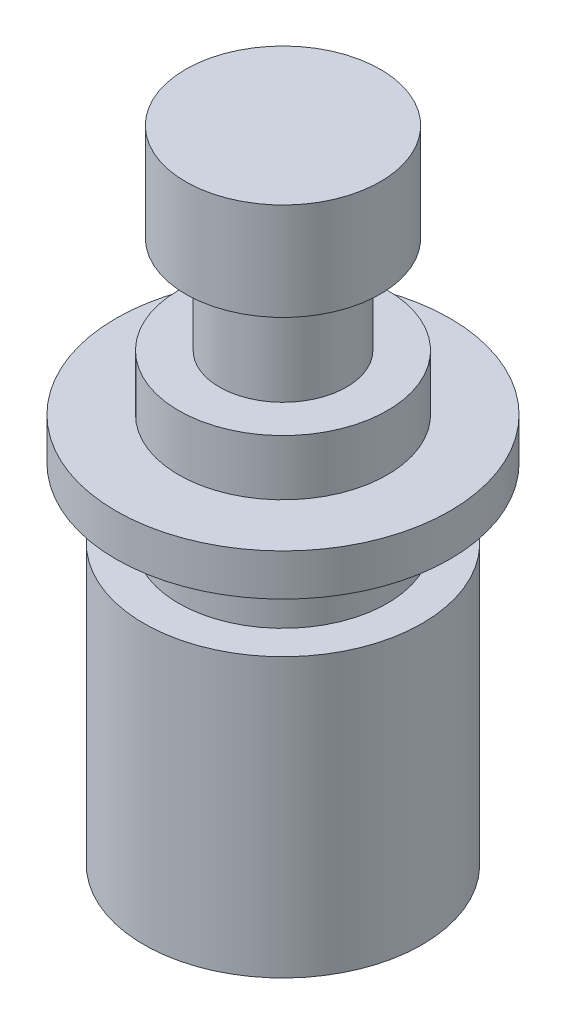
ISO-10303-21;
HEADER;
FILE_DESCRIPTION(('STEP AP214'),'2;1');
FILE_NAME('part.step','',(''),(''),'','','');
FILE_SCHEMA(('AUTOMOTIVE_DESIGN { 1 0 10303 214 1 1 1 1 }'));
ENDSEC;
DATA;
#1=APPLICATION_CONTEXT('core data for automotive mechanical design processes');
#2=APPLICATION_PROTOCOL_DEFINITION('international standard','automotive_design',2000,#1);
#3=PRODUCT_CONTEXT('',#1,'mechanical');
#4=PRODUCT('Part','Part','',(#3));
#5=PRODUCT_RELATED_PRODUCT_CATEGORY('part','',(#4));
#6=PRODUCT_DEFINITION_FORMATION('','',#4);
#7=PRODUCT_DEFINITION_CONTEXT('part definition',#1,'design');
#8=PRODUCT_DEFINITION('design','',#6,#7);
#9=PRODUCT_DEFINITION_SHAPE('','',#8);
#10=(LENGTH_UNIT() NAMED_UNIT(*) SI_UNIT(.MILLI.,.METRE.));
#11=(NAMED_UNIT(*) PLANE_ANGLE_UNIT() SI_UNIT($,.RADIAN.));
#12=(NAMED_UNIT(*) SI_UNIT($,.STERADIAN.) SOLID_ANGLE_UNIT());
#13=UNCERTAINTY_MEASURE_WITH_UNIT(LENGTH_MEASURE(1.E-05),#10,'distance_accuracy_value','');
#14=(GEOMETRIC_REPRESENTATION_CONTEXT(3) GLOBAL_UNCERTAINTY_ASSIGNED_CONTEXT((#13)) GLOBAL_UNIT_ASSIGNED_CONTEXT((#10,
#11,#12)) REPRESENTATION_CONTEXT('',''));
#15=CARTESIAN_POINT('',(0.,0.,0.));
#16=DIRECTION('',(0.,0.,1.));
#17=DIRECTION('',(1.,0.,0.));
#18=AXIS2_PLACEMENT_3D('',#15,#16,#17);
#19=CARTESIAN_POINT('',(0.,-72.5172203765227,0.));
#20=DIRECTION('',(0.,-1.,0.));
#21=DIRECTION('',(1.,0.,0.));
#22=AXIS2_PLACEMENT_3D('',#19,#20,#21);
#23=PLANE('',#22);
#24=CARTESIAN_POINT('',(0.,-72.5172203765227,0.));
#25=DIRECTION('',(0.,1.,0.));
#26=DIRECTION('',(-1.,0.,0.));
#27=AXIS2_PLACEMENT_3D('',#24,#25,#26);
#28=CIRCLE('',#27,3.5);
#29=CARTESIAN_POINT('',(-3.5,-72.5172203765227,0.));
#30=VERTEX_POINT('',#29);
#31=EDGE_CURVE('E10',#30,#30,#28,.T.);
#32=ORIENTED_EDGE('',*,*,#31,.T.);
#33=EDGE_LOOP('',(#32));
#34=FACE_BOUND('',#33,.T.);
#35=ADVANCED_FACE('F33',(#34),#23,.F.);
#36=CARTESIAN_POINT('',(0.,-72.5172203765227,0.));
#37=DIRECTION('',(0.,1.,0.));
#38=DIRECTION('',(-1.,0.,0.));
#39=AXIS2_PLACEMENT_3D('',#36,#37,#38);
#40=CYLINDRICAL_SURFACE('',#39,3.5);
#41=ORIENTED_EDGE('',*,*,#31,.F.);
#42=EDGE_LOOP('',(#41));
#43=FACE_BOUND('',#42,.T.);
#44=CARTESIAN_POINT('',(0.,-76.0172203765227,0.));
#45=DIRECTION('',(0.,1.,0.));
#46=DIRECTION('',(-1.,0.,0.));
#47=AXIS2_PLACEMENT_3D('',#44,#45,#46);
#48=CIRCLE('',#47,3.5);
#49=CARTESIAN_POINT('',(-3.5,-76.0172203765227,0.));
#50=VERTEX_POINT('',#49);
#51=EDGE_CURVE('E39',#50,#50,#48,.T.);
#52=ORIENTED_EDGE('',*,*,#51,.T.);
#53=EDGE_LOOP('',(#52));
#54=FACE_BOUND('',#53,.T.);
#55=ADVANCED_FACE('F89',(#43,#54),#40,.T.);
#56=CARTESIAN_POINT('',(3.5,-76.0172203765227,0.));
#57=DIRECTION('',(0.,1.,0.));
#58=DIRECTION('',(-1.,0.,0.));
#59=AXIS2_PLACEMENT_3D('',#56,#57,#58);
#60=PLANE('',#59);
#61=ORIENTED_EDGE('',*,*,#51,.F.);
#62=EDGE_LOOP('',(#61));
#63=FACE_BOUND('',#62,.T.);
#64=CARTESIAN_POINT('',(0.,-76.0172203765227,0.));
#65=DIRECTION('',(0.,1.,0.));
#66=DIRECTION('',(-1.,0.,0.));
#67=AXIS2_PLACEMENT_3D('',#64,#65,#66);
#68=CIRCLE('',#67,2.28578379991232);
#69=CARTESIAN_POINT('',(-2.28578379991232,-76.0172203765227,0.));
#70=VERTEX_POINT('',#69);
#71=EDGE_CURVE('E43',#70,#70,#68,.T.);
#72=ORIENTED_EDGE('',*,*,#71,.T.);
#73=EDGE_LOOP('',(#72));
#74=FACE_BOUND('',#73,.T.);
#75=ADVANCED_FACE('F93',(#63,#74),#60,.F.);
#76=CARTESIAN_POINT('',(0.,-72.5172203765227,0.));
#77=DIRECTION('',(0.,1.,0.));
#78=DIRECTION('',(-1.,0.,0.));
#79=AXIS2_PLACEMENT_3D('',#76,#77,#78);
#80=CYLINDRICAL_SURFACE('',#79,2.28578379991232);
#81=ORIENTED_EDGE('',*,*,#71,.F.);
#82=EDGE_LOOP('',(#81));
#83=FACE_BOUND('',#82,.T.);
#84=CARTESIAN_POINT('',(0.,-79.5172203765227,0.));
#85=DIRECTION('',(0.,1.,0.));
#86=DIRECTION('',(-1.,0.,0.));
#87=AXIS2_PLACEMENT_3D('',#84,#85,#86);
#88=CIRCLE('',#87,2.28578379991232);
#89=CARTESIAN_POINT('',(-2.28578379991232,-79.5172203765227,0.));
#90=VERTEX_POINT('',#89);
#91=EDGE_CURVE('E47',#90,#90,#88,.T.);
#92=ORIENTED_EDGE('',*,*,#91,.T.);
#93=EDGE_LOOP('',(#92));
#94=FACE_BOUND('',#93,.T.);
#95=ADVANCED_FACE('F98',(#83,#94),#80,.T.);
#96=CARTESIAN_POINT('',(2.28578379991232,-79.5172203765227,0.));
#97=DIRECTION('',(0.,-1.,0.));
#98=DIRECTION('',(1.,0.,0.));
#99=AXIS2_PLACEMENT_3D('',#96,#97,#98);
#100=PLANE('',#99);
#101=ORIENTED_EDGE('',*,*,#91,.F.);
#102=EDGE_LOOP('',(#101));
#103=FACE_BOUND('',#102,.T.);
#104=CARTESIAN_POINT('',(0.,-79.5172203765227,0.));
#105=DIRECTION('',(0.,1.,0.));
#106=DIRECTION('',(-1.,0.,0.));
#107=AXIS2_PLACEMENT_3D('',#104,#105,#106);
#108=CIRCLE('',#107,3.75);
#109=CARTESIAN_POINT('',(-3.75,-79.5172203765227,0.));
#110=VERTEX_POINT('',#109);
#111=EDGE_CURVE('E52',#110,#110,#108,.T.);
#112=ORIENTED_EDGE('',*,*,#111,.T.);
#113=EDGE_LOOP('',(#112));
#114=FACE_BOUND('',#113,.T.);
#115=ADVANCED_FACE('F104',(#103,#114),#100,.F.);
#116=CARTESIAN_POINT('',(0.,-72.5172203765227,0.));
#117=DIRECTION('',(0.,1.,0.));
#118=DIRECTION('',(-1.,0.,0.));
#119=AXIS2_PLACEMENT_3D('',#116,#117,#118);
#120=CYLINDRICAL_SURFACE('',#119,3.75);
#121=ORIENTED_EDGE('',*,*,#111,.F.);
#122=EDGE_LOOP('',(#121));
#123=FACE_BOUND('',#122,.T.);
#124=CARTESIAN_POINT('',(0.,-81.5172203765227,0.));
#125=DIRECTION('',(0.,1.,0.));
#126=DIRECTION('',(-1.,0.,0.));
#127=AXIS2_PLACEMENT_3D('',#124,#125,#126);
#128=CIRCLE('',#127,3.75);
#129=CARTESIAN_POINT('',(-3.75,-81.5172203765227,0.));
#130=VERTEX_POINT('',#129);
#131=EDGE_CURVE('E55',#130,#130,#128,.T.);
#132=ORIENTED_EDGE('',*,*,#131,.T.);
#133=EDGE_LOOP('',(#132));
#134=FACE_BOUND('',#133,.T.);
#135=ADVANCED_FACE('F108',(#123,#134),#120,.T.);
#136=CARTESIAN_POINT('',(3.75,-81.5172203765227,0.));
#137=DIRECTION('',(0.,-1.,0.));
#138=DIRECTION('',(1.,0.,0.));
#139=AXIS2_PLACEMENT_3D('',#136,#137,#138);
#140=PLANE('',#139);
#141=ORIENTED_EDGE('',*,*,#131,.F.);
#142=EDGE_LOOP('',(#141));
#143=FACE_BOUND('',#142,.T.);
#144=CARTESIAN_POINT('',(0.,-81.5172203765227,0.));
#145=DIRECTION('',(0.,1.,0.));
#146=DIRECTION('',(-1.,0.,0.));
#147=AXIS2_PLACEMENT_3D('',#144,#145,#146);
#148=CIRCLE('',#147,6.);
#149=CARTESIAN_POINT('',(-6.,-81.5172203765227,0.));
#150=VERTEX_POINT('',#149);
#151=EDGE_CURVE('E58',#150,#150,#148,.T.);
#152=ORIENTED_EDGE('',*,*,#151,.T.);
#153=EDGE_LOOP('',(#152));
#154=FACE_BOUND('',#153,.T.);
#155=ADVANCED_FACE('F112',(#143,#154),#140,.F.);
#156=CARTESIAN_POINT('',(0.,-72.5172203765227,0.));
#157=DIRECTION('',(0.,1.,0.));
#158=DIRECTION('',(-1.,0.,0.));
#159=AXIS2_PLACEMENT_3D('',#156,#157,#158);
#160=CYLINDRICAL_SURFACE('',#159,6.);
#161=ORIENTED_EDGE('',*,*,#151,.F.);
#162=EDGE_LOOP('',(#161));
#163=FACE_BOUND('',#162,.T.);
#164=CARTESIAN_POINT('',(0.,-83.0172203765227,0.));
#165=DIRECTION('',(0.,1.,0.));
#166=DIRECTION('',(-1.,0.,0.));
#167=AXIS2_PLACEMENT_3D('',#164,#165,#166);
#168=CIRCLE('',#167,6.);
#169=CARTESIAN_POINT('',(-6.,-83.0172203765227,0.));
#170=VERTEX_POINT('',#169);
#171=EDGE_CURVE('E61',#170,#170,#168,.T.);
#172=ORIENTED_EDGE('',*,*,#171,.T.);
#173=EDGE_LOOP('',(#172));
#174=FACE_BOUND('',#173,.T.);
#175=ADVANCED_FACE('F116',(#163,#174),#160,.T.);
#176=CARTESIAN_POINT('',(6.,-83.0172203765227,0.));
#177=DIRECTION('',(0.,1.,0.));
#178=DIRECTION('',(-1.,0.,0.));
#179=AXIS2_PLACEMENT_3D('',#176,#177,#178);
#180=PLANE('',#179);
#181=ORIENTED_EDGE('',*,*,#171,.F.);
#182=EDGE_LOOP('',(#181));
#183=FACE_BOUND('',#182,.T.);
#184=CARTESIAN_POINT('',(0.,-83.0172203765227,0.));
#185=DIRECTION('',(0.,1.,0.));
#186=DIRECTION('',(-1.,0.,0.));
#187=AXIS2_PLACEMENT_3D('',#184,#185,#186);
#188=CIRCLE('',#187,3.75);
#189=CARTESIAN_POINT('',(-3.75,-83.0172203765227,0.));
#190=VERTEX_POINT('',#189);
#191=EDGE_CURVE('E64',#190,#190,#188,.T.);
#192=ORIENTED_EDGE('',*,*,#191,.T.);
#193=EDGE_LOOP('',(#192));
#194=FACE_BOUND('',#193,.T.);
#195=ADVANCED_FACE('F120',(#183,#194),#180,.F.);
#196=CARTESIAN_POINT('',(0.,-72.5172203765227,0.));
#197=DIRECTION('',(0.,1.,0.));
#198=DIRECTION('',(-1.,0.,0.));
#199=AXIS2_PLACEMENT_3D('',#196,#197,#198);
#200=CYLINDRICAL_SURFACE('',#199,3.75);
#201=ORIENTED_EDGE('',*,*,#191,.F.);
#202=EDGE_LOOP('',(#201));
#203=FACE_BOUND('',#202,.T.);
#204=CARTESIAN_POINT('',(0.,-85.5172203765227,0.));
#205=DIRECTION('',(0.,1.,0.));
#206=DIRECTION('',(-1.,0.,0.));
#207=AXIS2_PLACEMENT_3D('',#204,#205,#206);
#208=CIRCLE('',#207,3.75);
#209=CARTESIAN_POINT('',(-3.75,-85.5172203765227,0.));
#210=VERTEX_POINT('',#209);
#211=EDGE_CURVE('E67',#210,#210,#208,.T.);
#212=ORIENTED_EDGE('',*,*,#211,.T.);
#213=EDGE_LOOP('',(#212));
#214=FACE_BOUND('',#213,.T.);
#215=ADVANCED_FACE('F124',(#203,#214),#200,.T.);
#216=CARTESIAN_POINT('',(3.75,-85.5172203765227,0.));
#217=DIRECTION('',(0.,-1.,0.));
#218=DIRECTION('',(1.,0.,0.));
#219=AXIS2_PLACEMENT_3D('',#216,#217,#218);
#220=PLANE('',#219);
#221=ORIENTED_EDGE('',*,*,#211,.F.);
#222=EDGE_LOOP('',(#221));
#223=FACE_BOUND('',#222,.T.);
#224=CARTESIAN_POINT('',(0.,-85.5172203765227,0.));
#225=DIRECTION('',(0.,1.,0.));
#226=DIRECTION('',(-1.,0.,0.));
#227=AXIS2_PLACEMENT_3D('',#224,#225,#226);
#228=CIRCLE('',#227,5.);
#229=CARTESIAN_POINT('',(-5.,-85.5172203765227,0.));
#230=VERTEX_POINT('',#229);
#231=EDGE_CURVE('E70',#230,#230,#228,.T.);
#232=ORIENTED_EDGE('',*,*,#231,.T.);
#233=EDGE_LOOP('',(#232));
#234=FACE_BOUND('',#233,.T.);
#235=ADVANCED_FACE('F85',(#223,#234),#220,.F.);
#236=CARTESIAN_POINT('',(0.,-72.5172203765227,0.));
#237=DIRECTION('',(0.,1.,0.));
#238=DIRECTION('',(-1.,0.,0.));
#239=AXIS2_PLACEMENT_3D('',#236,#237,#238);
#240=CYLINDRICAL_SURFACE('',#239,5.);
#241=ORIENTED_EDGE('',*,*,#231,.F.);
#242=EDGE_LOOP('',(#241));
#243=FACE_BOUND('',#242,.T.);
#244=CARTESIAN_POINT('',(0.,-95.5172203765227,0.));
#245=DIRECTION('',(0.,1.,0.));
#246=DIRECTION('',(-1.,0.,0.));
#247=AXIS2_PLACEMENT_3D('',#244,#245,#246);
#248=CIRCLE('',#247,5.);
#249=CARTESIAN_POINT('',(-5.,-95.5172203765227,0.));
#250=VERTEX_POINT('',#249);
#251=EDGE_CURVE('E73',#250,#250,#248,.T.);
#252=ORIENTED_EDGE('',*,*,#251,.T.);
#253=EDGE_LOOP('',(#252));
#254=FACE_BOUND('',#253,.T.);
#255=ADVANCED_FACE('F77',(#243,#254),#240,.T.);
#256=CARTESIAN_POINT('',(5.,-95.5172203765227,0.));
#257=DIRECTION('',(0.,1.,0.));
#258=DIRECTION('',(-1.,0.,0.));
#259=AXIS2_PLACEMENT_3D('',#256,#257,#258);
#260=PLANE('',#259);
#261=ORIENTED_EDGE('',*,*,#251,.F.);
#262=EDGE_LOOP('',(#261));
#263=FACE_BOUND('',#262,.T.);
#264=ADVANCED_FACE('F79',(#263),#260,.F.);
#265=CLOSED_SHELL('',(#35,#55,#75,#95,#115,#135,#155,#175,#195,#215,#235,#255,#264));
#266=MANIFOLD_SOLID_BREP('B2',#265);
#267=ADVANCED_BREP_SHAPE_REPRESENTATION('',(#18,#266),#14);
#268=SHAPE_DEFINITION_REPRESENTATION(#9,#267);
ENDSEC;
END-ISO-10303-21;
